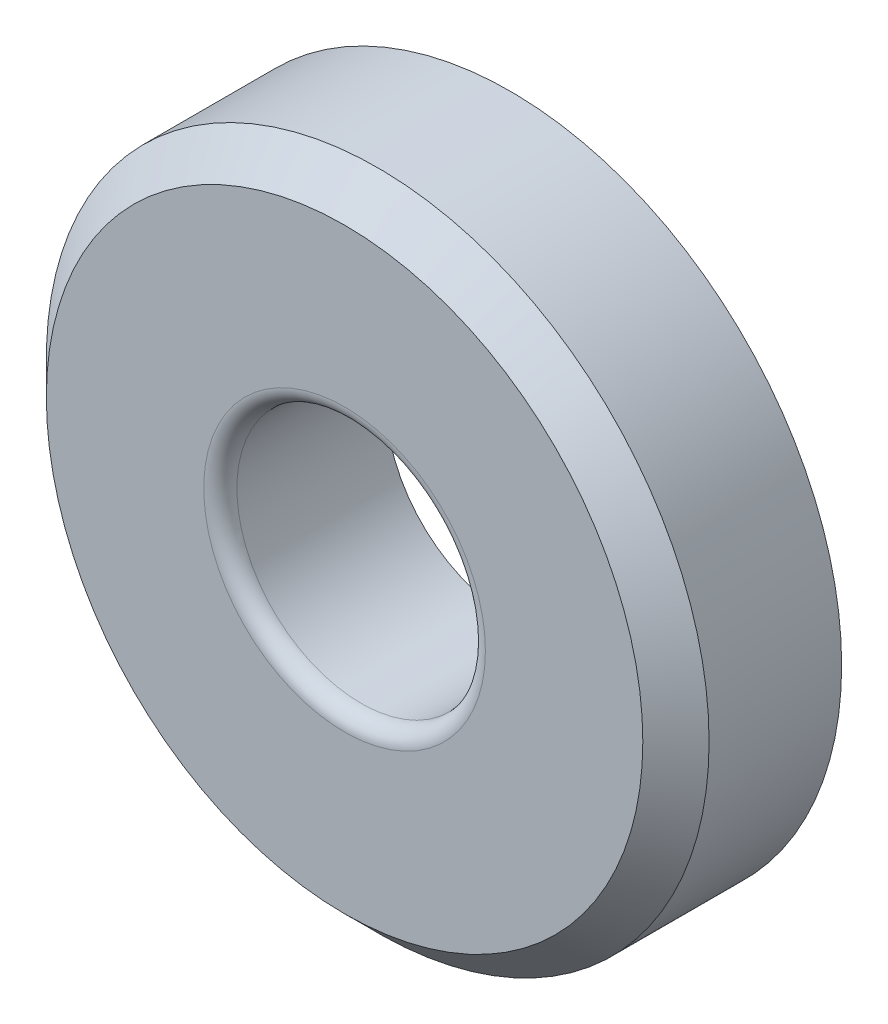
ISO-10303-21;
HEADER;
FILE_DESCRIPTION(('STEP AP214'),'2;1');
FILE_NAME('part.step','',(''),(''),'','','');
FILE_SCHEMA(('AUTOMOTIVE_DESIGN { 1 0 10303 214 1 1 1 1 }'));
ENDSEC;
DATA;
#1=APPLICATION_CONTEXT('core data for automotive mechanical design processes');
#2=APPLICATION_PROTOCOL_DEFINITION('international standard','automotive_design',2000,#1);
#3=PRODUCT_CONTEXT('',#1,'mechanical');
#4=PRODUCT('Part','Part','',(#3));
#5=PRODUCT_RELATED_PRODUCT_CATEGORY('part','',(#4));
#6=PRODUCT_DEFINITION_FORMATION('','',#4);
#7=PRODUCT_DEFINITION_CONTEXT('part definition',#1,'design');
#8=PRODUCT_DEFINITION('design','',#6,#7);
#9=PRODUCT_DEFINITION_SHAPE('','',#8);
#10=(LENGTH_UNIT() NAMED_UNIT(*) SI_UNIT(.MILLI.,.METRE.));
#11=(NAMED_UNIT(*) PLANE_ANGLE_UNIT() SI_UNIT($,.RADIAN.));
#12=(NAMED_UNIT(*) SI_UNIT($,.STERADIAN.) SOLID_ANGLE_UNIT());
#13=UNCERTAINTY_MEASURE_WITH_UNIT(LENGTH_MEASURE(1.E-05),#10,'distance_accuracy_value','');
#14=(GEOMETRIC_REPRESENTATION_CONTEXT(3) GLOBAL_UNCERTAINTY_ASSIGNED_CONTEXT((#13)) GLOBAL_UNIT_ASSIGNED_CONTEXT((#10,
#11,#12)) REPRESENTATION_CONTEXT('',''));
#15=CARTESIAN_POINT('',(0.,0.,0.));
#16=DIRECTION('',(0.,0.,1.));
#17=DIRECTION('',(1.,0.,0.));
#18=AXIS2_PLACEMENT_3D('',#15,#16,#17);
#19=CARTESIAN_POINT('',(0.,0.,12.7));
#20=DIRECTION('',(0.,0.,1.));
#21=DIRECTION('',(1.,0.,0.));
#22=AXIS2_PLACEMENT_3D('',#19,#20,#21);
#23=PLANE('',#22);
#24=CARTESIAN_POINT('',(0.,0.,12.7));
#25=DIRECTION('',(0.,0.,1.));
#26=DIRECTION('',(1.,0.,0.));
#27=AXIS2_PLACEMENT_3D('',#24,#25,#26);
#28=CIRCLE('',#27,10.795);
#29=CARTESIAN_POINT('',(10.795,0.,12.7));
#30=VERTEX_POINT('',#29);
#31=EDGE_CURVE('E10',#30,#30,#28,.F.);
#32=ORIENTED_EDGE('',*,*,#31,.T.);
#33=EDGE_LOOP('',(#32));
#34=FACE_BOUND('',#33,.T.);
#35=CARTESIAN_POINT('',(0.,0.,12.7));
#36=DIRECTION('',(0.,0.,1.));
#37=DIRECTION('',(1.,0.,0.));
#38=AXIS2_PLACEMENT_3D('',#35,#36,#37);
#39=CIRCLE('',#38,22.86);
#40=CARTESIAN_POINT('',(22.86,0.,12.7));
#41=VERTEX_POINT('',#40);
#42=EDGE_CURVE('E51',#41,#41,#39,.T.);
#43=ORIENTED_EDGE('',*,*,#42,.T.);
#44=EDGE_LOOP('',(#43));
#45=FACE_BOUND('',#44,.T.);
#46=ADVANCED_FACE('F36',(#34,#45),#23,.T.);
#47=CARTESIAN_POINT('',(0.,0.,0.));
#48=DIRECTION('',(0.,0.,1.));
#49=DIRECTION('',(1.,0.,0.));
#50=AXIS2_PLACEMENT_3D('',#47,#48,#49);
#51=PLANE('',#50);
#52=CARTESIAN_POINT('',(0.,0.,0.));
#53=DIRECTION('',(0.,0.,1.));
#54=DIRECTION('',(1.,0.,0.));
#55=AXIS2_PLACEMENT_3D('',#52,#53,#54);
#56=CIRCLE('',#55,25.4);
#57=CARTESIAN_POINT('',(25.4,0.,0.));
#58=VERTEX_POINT('',#57);
#59=EDGE_CURVE('E56',#58,#58,#56,.T.);
#60=ORIENTED_EDGE('',*,*,#59,.F.);
#61=EDGE_LOOP('',(#60));
#62=FACE_BOUND('',#61,.T.);
#63=CARTESIAN_POINT('',(0.,0.,0.));
#64=DIRECTION('',(0.,0.,1.));
#65=DIRECTION('',(1.,0.,0.));
#66=AXIS2_PLACEMENT_3D('',#63,#64,#65);
#67=CIRCLE('',#66,9.525);
#68=CARTESIAN_POINT('',(9.525,0.,0.));
#69=VERTEX_POINT('',#68);
#70=EDGE_CURVE('E59',#69,#69,#67,.T.);
#71=ORIENTED_EDGE('',*,*,#70,.T.);
#72=EDGE_LOOP('',(#71));
#73=FACE_BOUND('',#72,.T.);
#74=ADVANCED_FACE('F63',(#62,#73),#51,.F.);
#75=CARTESIAN_POINT('',(0.,0.,12.7));
#76=DIRECTION('',(0.,0.,-1.));
#77=DIRECTION('',(-1.,0.,0.));
#78=AXIS2_PLACEMENT_3D('',#75,#76,#77);
#79=CYLINDRICAL_SURFACE('',#78,25.4);
#80=CARTESIAN_POINT('',(0.,0.,10.16));
#81=DIRECTION('',(0.,0.,1.));
#82=DIRECTION('',(1.,0.,0.));
#83=AXIS2_PLACEMENT_3D('',#80,#81,#82);
#84=CIRCLE('',#83,25.4);
#85=CARTESIAN_POINT('',(25.4,0.,10.16));
#86=VERTEX_POINT('',#85);
#87=EDGE_CURVE('E47',#86,#86,#84,.F.);
#88=ORIENTED_EDGE('',*,*,#87,.T.);
#89=EDGE_LOOP('',(#88));
#90=FACE_BOUND('',#89,.T.);
#91=ORIENTED_EDGE('',*,*,#59,.T.);
#92=EDGE_LOOP('',(#91));
#93=FACE_BOUND('',#92,.T.);
#94=ADVANCED_FACE('F68',(#90,#93),#79,.T.);
#95=CARTESIAN_POINT('',(0.,0.,12.7));
#96=DIRECTION('',(0.,0.,-1.));
#97=DIRECTION('',(-1.,0.,0.));
#98=AXIS2_PLACEMENT_3D('',#95,#96,#97);
#99=CYLINDRICAL_SURFACE('',#98,9.525);
#100=CARTESIAN_POINT('',(0.,0.,11.43));
#101=DIRECTION('',(0.,0.,1.));
#102=DIRECTION('',(1.,0.,0.));
#103=AXIS2_PLACEMENT_3D('',#100,#101,#102);
#104=CIRCLE('',#103,9.525);
#105=CARTESIAN_POINT('',(9.525,0.,11.43));
#106=VERTEX_POINT('',#105);
#107=EDGE_CURVE('E43',#106,#106,#104,.T.);
#108=ORIENTED_EDGE('',*,*,#107,.T.);
#109=EDGE_LOOP('',(#108));
#110=FACE_BOUND('',#109,.T.);
#111=ORIENTED_EDGE('',*,*,#70,.F.);
#112=EDGE_LOOP('',(#111));
#113=FACE_BOUND('',#112,.T.);
#114=ADVANCED_FACE('F65',(#110,#113),#99,.F.);
#115=CARTESIAN_POINT('',(0.,0.,12.7));
#116=DIRECTION('',(0.,0.,-1.));
#117=DIRECTION('',(-1.,0.,0.));
#118=AXIS2_PLACEMENT_3D('',#115,#116,#117);
#119=CONICAL_SURFACE('',#118,22.86,0.785398163397446);
#120=ORIENTED_EDGE('',*,*,#87,.F.);
#121=EDGE_LOOP('',(#120));
#122=FACE_BOUND('',#121,.T.);
#123=ORIENTED_EDGE('',*,*,#42,.F.);
#124=EDGE_LOOP('',(#123));
#125=FACE_BOUND('',#124,.T.);
#126=ADVANCED_FACE('F67',(#122,#125),#119,.T.);
#127=CARTESIAN_POINT('',(0.,0.,11.43));
#128=DIRECTION('',(0.,0.,1.));
#129=DIRECTION('',(1.,0.,0.));
#130=AXIS2_PLACEMENT_3D('',#127,#128,#129);
#131=TOROIDAL_SURFACE('',#130,10.795,1.27);
#132=ORIENTED_EDGE('',*,*,#31,.F.);
#133=EDGE_LOOP('',(#132));
#134=FACE_BOUND('',#133,.T.);
#135=ORIENTED_EDGE('',*,*,#107,.F.);
#136=EDGE_LOOP('',(#135));
#137=FACE_BOUND('',#136,.T.);
#138=ADVANCED_FACE('F38',(#134,#137),#131,.T.);
#139=CLOSED_SHELL('',(#46,#74,#94,#114,#126,#138));
#140=MANIFOLD_SOLID_BREP('B2',#139);
#141=ADVANCED_BREP_SHAPE_REPRESENTATION('',(#18,#140),#14);
#142=SHAPE_DEFINITION_REPRESENTATION(#9,#141);
ENDSEC;
END-ISO-10303-21;
